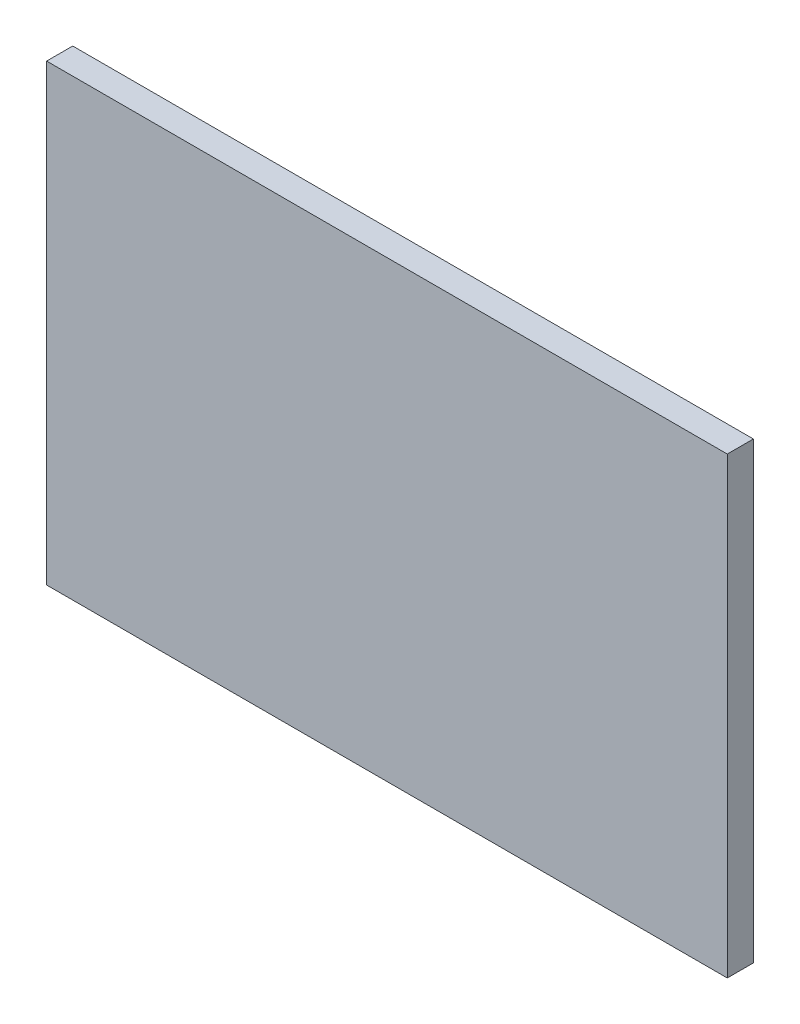
ISO-10303-21;
HEADER;
FILE_DESCRIPTION(('STEP AP214'),'2;1');
FILE_NAME('part.step','',(''),(''),'','','');
FILE_SCHEMA(('AUTOMOTIVE_DESIGN { 1 0 10303 214 1 1 1 1 }'));
ENDSEC;
DATA;
#1=APPLICATION_CONTEXT('core data for automotive mechanical design processes');
#2=APPLICATION_PROTOCOL_DEFINITION('international standard','automotive_design',2000,#1);
#3=PRODUCT_CONTEXT('',#1,'mechanical');
#4=PRODUCT('Part','Part','',(#3));
#5=PRODUCT_RELATED_PRODUCT_CATEGORY('part','',(#4));
#6=PRODUCT_DEFINITION_FORMATION('','',#4);
#7=PRODUCT_DEFINITION_CONTEXT('part definition',#1,'design');
#8=PRODUCT_DEFINITION('design','',#6,#7);
#9=PRODUCT_DEFINITION_SHAPE('','',#8);
#10=(LENGTH_UNIT() NAMED_UNIT(*) SI_UNIT(.MILLI.,.METRE.));
#11=(NAMED_UNIT(*) PLANE_ANGLE_UNIT() SI_UNIT($,.RADIAN.));
#12=(NAMED_UNIT(*) SI_UNIT($,.STERADIAN.) SOLID_ANGLE_UNIT());
#13=UNCERTAINTY_MEASURE_WITH_UNIT(LENGTH_MEASURE(1.E-05),#10,'distance_accuracy_value','');
#14=(GEOMETRIC_REPRESENTATION_CONTEXT(3) GLOBAL_UNCERTAINTY_ASSIGNED_CONTEXT((#13)) GLOBAL_UNIT_ASSIGNED_CONTEXT((#10,
#11,#12)) REPRESENTATION_CONTEXT('',''));
#15=CARTESIAN_POINT('',(0.,0.,0.));
#16=DIRECTION('',(0.,0.,1.));
#17=DIRECTION('',(1.,0.,0.));
#18=AXIS2_PLACEMENT_3D('',#15,#16,#17);
#19=CARTESIAN_POINT('',(0.,50.8,-2.921));
#20=DIRECTION('',(-1.,0.,0.));
#21=DIRECTION('',(0.,-1.,0.));
#22=AXIS2_PLACEMENT_3D('',#19,#20,#21);
#23=PLANE('',#22);
#24=DIRECTION('',(0.,-1.,0.));
#25=VECTOR('',#24,1.);
#26=CARTESIAN_POINT('',(0.,50.8,0.));
#27=LINE('',#26,#25);
#28=CARTESIAN_POINT('',(0.,50.8,0.));
#29=VERTEX_POINT('',#28);
#30=CARTESIAN_POINT('',(0.,0.,0.));
#31=VERTEX_POINT('',#30);
#32=EDGE_CURVE('E100',#29,#31,#27,.T.);
#33=ORIENTED_EDGE('',*,*,#32,.F.);
#34=DIRECTION('',(0.,0.,1.));
#35=VECTOR('',#34,1.);
#36=CARTESIAN_POINT('',(0.,50.8,-2.921));
#37=LINE('',#36,#35);
#38=CARTESIAN_POINT('',(0.,50.8,-2.921));
#39=VERTEX_POINT('',#38);
#40=EDGE_CURVE('E11',#39,#29,#37,.T.);
#41=ORIENTED_EDGE('',*,*,#40,.F.);
#42=DIRECTION('',(0.,-1.,0.));
#43=VECTOR('',#42,1.);
#44=CARTESIAN_POINT('',(0.,50.8,-2.921));
#45=LINE('',#44,#43);
#46=CARTESIAN_POINT('',(0.,0.,-2.921));
#47=VERTEX_POINT('',#46);
#48=EDGE_CURVE('E94',#39,#47,#45,.T.);
#49=ORIENTED_EDGE('',*,*,#48,.T.);
#50=DIRECTION('',(0.,0.,1.));
#51=VECTOR('',#50,1.);
#52=CARTESIAN_POINT('',(0.,0.,-2.921));
#53=LINE('',#52,#51);
#54=EDGE_CURVE('E39',#47,#31,#53,.T.);
#55=ORIENTED_EDGE('',*,*,#54,.T.);
#56=EDGE_LOOP('',(#33,#41,#49,#55));
#57=FACE_BOUND('',#56,.T.);
#58=ADVANCED_FACE('F36',(#57),#23,.T.);
#59=CARTESIAN_POINT('',(0.,50.8,-2.921));
#60=DIRECTION('',(0.,1.,0.));
#61=DIRECTION('',(0.,0.,1.));
#62=AXIS2_PLACEMENT_3D('',#59,#60,#61);
#63=PLANE('',#62);
#64=DIRECTION('',(-1.,0.,0.));
#65=VECTOR('',#64,1.);
#66=CARTESIAN_POINT('',(0.,50.8,0.));
#67=LINE('',#66,#65);
#68=CARTESIAN_POINT('',(76.2,50.8,0.));
#69=VERTEX_POINT('',#68);
#70=EDGE_CURVE('E96',#69,#29,#67,.T.);
#71=ORIENTED_EDGE('',*,*,#70,.F.);
#72=DIRECTION('',(0.,0.,1.));
#73=VECTOR('',#72,1.);
#74=CARTESIAN_POINT('',(76.2,50.8,-2.921));
#75=LINE('',#74,#73);
#76=CARTESIAN_POINT('',(76.2,50.8,-2.921));
#77=VERTEX_POINT('',#76);
#78=EDGE_CURVE('E45',#77,#69,#75,.T.);
#79=ORIENTED_EDGE('',*,*,#78,.F.);
#80=DIRECTION('',(-1.,0.,0.));
#81=VECTOR('',#80,1.);
#82=CARTESIAN_POINT('',(0.,50.8,-2.921));
#83=LINE('',#82,#81);
#84=EDGE_CURVE('E91',#77,#39,#83,.T.);
#85=ORIENTED_EDGE('',*,*,#84,.T.);
#86=ORIENTED_EDGE('',*,*,#40,.T.);
#87=EDGE_LOOP('',(#71,#79,#85,#86));
#88=FACE_BOUND('',#87,.T.);
#89=ADVANCED_FACE('F110',(#88),#63,.T.);
#90=CARTESIAN_POINT('',(76.2,50.8,-2.921));
#91=DIRECTION('',(1.,0.,0.));
#92=DIRECTION('',(0.,0.,-1.));
#93=AXIS2_PLACEMENT_3D('',#90,#91,#92);
#94=PLANE('',#93);
#95=DIRECTION('',(0.,1.,0.));
#96=VECTOR('',#95,1.);
#97=CARTESIAN_POINT('',(76.2,50.8,0.));
#98=LINE('',#97,#96);
#99=CARTESIAN_POINT('',(76.2,0.,0.));
#100=VERTEX_POINT('',#99);
#101=EDGE_CURVE('E86',#100,#69,#98,.T.);
#102=ORIENTED_EDGE('',*,*,#101,.F.);
#103=DIRECTION('',(0.,0.,1.));
#104=VECTOR('',#103,1.);
#105=CARTESIAN_POINT('',(76.2,0.,-2.921));
#106=LINE('',#105,#104);
#107=CARTESIAN_POINT('',(76.2,0.,-2.921));
#108=VERTEX_POINT('',#107);
#109=EDGE_CURVE('E81',#108,#100,#106,.T.);
#110=ORIENTED_EDGE('',*,*,#109,.F.);
#111=DIRECTION('',(0.,1.,0.));
#112=VECTOR('',#111,1.);
#113=CARTESIAN_POINT('',(76.2,50.8,-2.921));
#114=LINE('',#113,#112);
#115=EDGE_CURVE('E84',#108,#77,#114,.T.);
#116=ORIENTED_EDGE('',*,*,#115,.T.);
#117=ORIENTED_EDGE('',*,*,#78,.T.);
#118=EDGE_LOOP('',(#102,#110,#116,#117));
#119=FACE_BOUND('',#118,.T.);
#120=ADVANCED_FACE('F83',(#119),#94,.T.);
#121=CARTESIAN_POINT('',(0.,0.,-2.921));
#122=DIRECTION('',(0.,-1.,0.));
#123=DIRECTION('',(0.,0.,-1.));
#124=AXIS2_PLACEMENT_3D('',#121,#122,#123);
#125=PLANE('',#124);
#126=DIRECTION('',(1.,0.,0.));
#127=VECTOR('',#126,1.);
#128=CARTESIAN_POINT('',(0.,0.,0.));
#129=LINE('',#128,#127);
#130=EDGE_CURVE('E103',#31,#100,#129,.T.);
#131=ORIENTED_EDGE('',*,*,#130,.F.);
#132=ORIENTED_EDGE('',*,*,#54,.F.);
#133=DIRECTION('',(1.,0.,0.));
#134=VECTOR('',#133,1.);
#135=CARTESIAN_POINT('',(0.,0.,-2.921));
#136=LINE('',#135,#134);
#137=EDGE_CURVE('E90',#47,#108,#136,.T.);
#138=ORIENTED_EDGE('',*,*,#137,.T.);
#139=ORIENTED_EDGE('',*,*,#109,.T.);
#140=EDGE_LOOP('',(#131,#132,#138,#139));
#141=FACE_BOUND('',#140,.T.);
#142=ADVANCED_FACE('F93',(#141),#125,.T.);
#143=CARTESIAN_POINT('',(0.,0.,-2.921));
#144=DIRECTION('',(0.,0.,1.));
#145=DIRECTION('',(1.,0.,0.));
#146=AXIS2_PLACEMENT_3D('',#143,#144,#145);
#147=PLANE('',#146);
#148=ORIENTED_EDGE('',*,*,#48,.F.);
#149=ORIENTED_EDGE('',*,*,#84,.F.);
#150=ORIENTED_EDGE('',*,*,#115,.F.);
#151=ORIENTED_EDGE('',*,*,#137,.F.);
#152=EDGE_LOOP('',(#148,#149,#150,#151));
#153=FACE_BOUND('',#152,.T.);
#154=ADVANCED_FACE('F89',(#153),#147,.F.);
#155=CARTESIAN_POINT('',(0.,0.,0.));
#156=DIRECTION('',(0.,0.,1.));
#157=DIRECTION('',(1.,0.,0.));
#158=AXIS2_PLACEMENT_3D('',#155,#156,#157);
#159=PLANE('',#158);
#160=ORIENTED_EDGE('',*,*,#32,.T.);
#161=ORIENTED_EDGE('',*,*,#130,.T.);
#162=ORIENTED_EDGE('',*,*,#101,.T.);
#163=ORIENTED_EDGE('',*,*,#70,.T.);
#164=EDGE_LOOP('',(#160,#161,#162,#163));
#165=FACE_BOUND('',#164,.T.);
#166=ADVANCED_FACE('F109',(#165),#159,.T.);
#167=CLOSED_SHELL('',(#58,#89,#120,#142,#154,#166));
#168=MANIFOLD_SOLID_BREP('B2',#167);
#169=ADVANCED_BREP_SHAPE_REPRESENTATION('',(#18,#168),#14);
#170=SHAPE_DEFINITION_REPRESENTATION(#9,#169);
ENDSEC;
END-ISO-10303-21;
